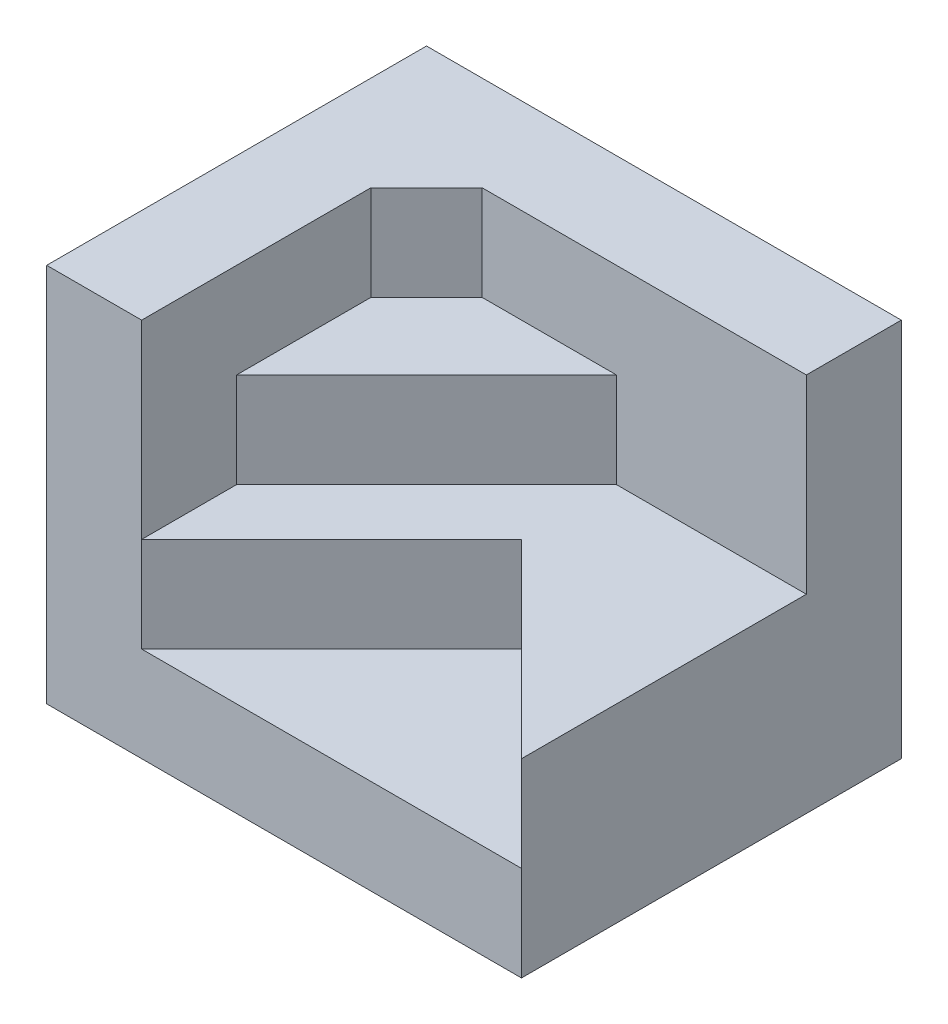
ISO-10303-21;
HEADER;
FILE_DESCRIPTION(('STEP AP214'),'2;1');
FILE_NAME('part.step','',(''),(''),'','','');
FILE_SCHEMA(('AUTOMOTIVE_DESIGN { 1 0 10303 214 1 1 1 1 }'));
ENDSEC;
DATA;
#1=APPLICATION_CONTEXT('core data for automotive mechanical design processes');
#2=APPLICATION_PROTOCOL_DEFINITION('international standard','automotive_design',2000,#1);
#3=PRODUCT_CONTEXT('',#1,'mechanical');
#4=PRODUCT('Part','Part','',(#3));
#5=PRODUCT_RELATED_PRODUCT_CATEGORY('part','',(#4));
#6=PRODUCT_DEFINITION_FORMATION('','',#4);
#7=PRODUCT_DEFINITION_CONTEXT('part definition',#1,'design');
#8=PRODUCT_DEFINITION('design','',#6,#7);
#9=PRODUCT_DEFINITION_SHAPE('','',#8);
#10=(LENGTH_UNIT() NAMED_UNIT(*) SI_UNIT(.MILLI.,.METRE.));
#11=(NAMED_UNIT(*) PLANE_ANGLE_UNIT() SI_UNIT($,.RADIAN.));
#12=(NAMED_UNIT(*) SI_UNIT($,.STERADIAN.) SOLID_ANGLE_UNIT());
#13=UNCERTAINTY_MEASURE_WITH_UNIT(LENGTH_MEASURE(1.E-05),#10,'distance_accuracy_value','');
#14=(GEOMETRIC_REPRESENTATION_CONTEXT(3) GLOBAL_UNCERTAINTY_ASSIGNED_CONTEXT((#13)) GLOBAL_UNIT_ASSIGNED_CONTEXT((#10,
#11,#12)) REPRESENTATION_CONTEXT('',''));
#15=CARTESIAN_POINT('',(0.,0.,0.));
#16=DIRECTION('',(0.,0.,1.));
#17=DIRECTION('',(1.,0.,0.));
#18=AXIS2_PLACEMENT_3D('',#15,#16,#17);
#19=CARTESIAN_POINT('',(-40.,40.,-20.));
#20=DIRECTION('',(0.,0.,-1.));
#21=DIRECTION('',(-1.,0.,0.));
#22=AXIS2_PLACEMENT_3D('',#19,#20,#21);
#23=PLANE('',#22);
#24=DIRECTION('',(1.,0.,0.));
#25=VECTOR('',#24,1.);
#26=CARTESIAN_POINT('',(-40.,0.,-20.));
#27=LINE('',#26,#25);
#28=CARTESIAN_POINT('',(-40.,0.,-20.));
#29=VERTEX_POINT('',#28);
#30=CARTESIAN_POINT('',(10.,0.,-20.));
#31=VERTEX_POINT('',#30);
#32=EDGE_CURVE('E167',#29,#31,#27,.T.);
#33=ORIENTED_EDGE('',*,*,#32,.F.);
#34=DIRECTION('',(0.,-1.,0.));
#35=VECTOR('',#34,1.);
#36=CARTESIAN_POINT('',(-40.,40.,-20.));
#37=LINE('',#36,#35);
#38=CARTESIAN_POINT('',(-40.,40.,-20.));
#39=VERTEX_POINT('',#38);
#40=EDGE_CURVE('E11',#39,#29,#37,.T.);
#41=ORIENTED_EDGE('',*,*,#40,.F.);
#42=DIRECTION('',(1.,0.,0.));
#43=VECTOR('',#42,1.);
#44=CARTESIAN_POINT('',(-40.,40.,-20.));
#45=LINE('',#44,#43);
#46=CARTESIAN_POINT('',(10.,40.,-20.));
#47=VERTEX_POINT('',#46);
#48=EDGE_CURVE('E163',#39,#47,#45,.T.);
#49=ORIENTED_EDGE('',*,*,#48,.T.);
#50=DIRECTION('',(0.,-1.,0.));
#51=VECTOR('',#50,1.);
#52=CARTESIAN_POINT('',(10.,40.,-20.));
#53=LINE('',#52,#51);
#54=EDGE_CURVE('E39',#47,#31,#53,.T.);
#55=ORIENTED_EDGE('',*,*,#54,.T.);
#56=EDGE_LOOP('',(#33,#41,#49,#55));
#57=FACE_BOUND('',#56,.T.);
#58=ADVANCED_FACE('F36',(#57),#23,.T.);
#59=CARTESIAN_POINT('',(-40.,40.,-20.));
#60=DIRECTION('',(1.,0.,0.));
#61=DIRECTION('',(0.,0.,-1.));
#62=AXIS2_PLACEMENT_3D('',#59,#60,#61);
#63=PLANE('',#62);
#64=DIRECTION('',(0.,0.,1.));
#65=VECTOR('',#64,1.);
#66=CARTESIAN_POINT('',(-40.,0.,-20.));
#67=LINE('',#66,#65);
#68=CARTESIAN_POINT('',(-40.,0.,20.));
#69=VERTEX_POINT('',#68);
#70=EDGE_CURVE('E70',#29,#69,#67,.T.);
#71=ORIENTED_EDGE('',*,*,#70,.T.);
#72=DIRECTION('',(0.,-1.,0.));
#73=VECTOR('',#72,1.);
#74=CARTESIAN_POINT('',(-40.,40.,20.));
#75=LINE('',#74,#73);
#76=CARTESIAN_POINT('',(-40.,40.,20.));
#77=VERTEX_POINT('',#76);
#78=EDGE_CURVE('E45',#77,#69,#75,.T.);
#79=ORIENTED_EDGE('',*,*,#78,.F.);
#80=DIRECTION('',(0.,0.,1.));
#81=VECTOR('',#80,1.);
#82=CARTESIAN_POINT('',(-40.,40.,-20.));
#83=LINE('',#82,#81);
#84=EDGE_CURVE('E171',#39,#77,#83,.T.);
#85=ORIENTED_EDGE('',*,*,#84,.F.);
#86=ORIENTED_EDGE('',*,*,#40,.T.);
#87=EDGE_LOOP('',(#71,#79,#85,#86));
#88=FACE_BOUND('',#87,.T.);
#89=ADVANCED_FACE('F268',(#88),#63,.F.);
#90=CARTESIAN_POINT('',(-40.,40.,20.));
#91=DIRECTION('',(0.,0.,-1.));
#92=DIRECTION('',(-1.,0.,0.));
#93=AXIS2_PLACEMENT_3D('',#90,#91,#92);
#94=PLANE('',#93);
#95=DIRECTION('',(1.,0.,0.));
#96=VECTOR('',#95,1.);
#97=CARTESIAN_POINT('',(10.,10.,20.));
#98=LINE('',#97,#96);
#99=CARTESIAN_POINT('',(-30.,10.,20.));
#100=VERTEX_POINT('',#99);
#101=CARTESIAN_POINT('',(10.,10.,20.));
#102=VERTEX_POINT('',#101);
#103=EDGE_CURVE('E141',#100,#102,#98,.T.);
#104=ORIENTED_EDGE('',*,*,#103,.F.);
#105=DIRECTION('',(0.,1.,0.));
#106=VECTOR('',#105,1.);
#107=CARTESIAN_POINT('',(-30.,10.,20.));
#108=LINE('',#107,#106);
#109=CARTESIAN_POINT('',(-30.,20.,20.));
#110=VERTEX_POINT('',#109);
#111=EDGE_CURVE('E223',#100,#110,#108,.T.);
#112=ORIENTED_EDGE('',*,*,#111,.T.);
#113=DIRECTION('',(0.,1.,0.));
#114=VECTOR('',#113,1.);
#115=CARTESIAN_POINT('',(-30.,20.,20.));
#116=LINE('',#115,#114);
#117=CARTESIAN_POINT('',(-30.,40.,20.));
#118=VERTEX_POINT('',#117);
#119=EDGE_CURVE('E206',#110,#118,#116,.T.);
#120=ORIENTED_EDGE('',*,*,#119,.T.);
#121=DIRECTION('',(1.,0.,0.));
#122=VECTOR('',#121,1.);
#123=CARTESIAN_POINT('',(-40.,40.,20.));
#124=LINE('',#123,#122);
#125=EDGE_CURVE('E173',#77,#118,#124,.T.);
#126=ORIENTED_EDGE('',*,*,#125,.F.);
#127=ORIENTED_EDGE('',*,*,#78,.T.);
#128=DIRECTION('',(1.,0.,0.));
#129=VECTOR('',#128,1.);
#130=CARTESIAN_POINT('',(-40.,0.,20.));
#131=LINE('',#130,#129);
#132=CARTESIAN_POINT('',(10.,0.,20.));
#133=VERTEX_POINT('',#132);
#134=EDGE_CURVE('E154',#69,#133,#131,.T.);
#135=ORIENTED_EDGE('',*,*,#134,.T.);
#136=DIRECTION('',(0.,-1.,0.));
#137=VECTOR('',#136,1.);
#138=CARTESIAN_POINT('',(10.,40.,20.));
#139=LINE('',#138,#137);
#140=EDGE_CURVE('E151',#102,#133,#139,.T.);
#141=ORIENTED_EDGE('',*,*,#140,.F.);
#142=EDGE_LOOP('',(#104,#112,#120,#126,#127,#135,#141));
#143=FACE_BOUND('',#142,.T.);
#144=ADVANCED_FACE('F152',(#143),#94,.F.);
#145=CARTESIAN_POINT('',(10.,40.,-20.));
#146=DIRECTION('',(1.,0.,0.));
#147=DIRECTION('',(0.,0.,-1.));
#148=AXIS2_PLACEMENT_3D('',#145,#146,#147);
#149=PLANE('',#148);
#150=DIRECTION('',(0.,1.,0.));
#151=VECTOR('',#150,1.);
#152=CARTESIAN_POINT('',(10.,20.,-10.));
#153=LINE('',#152,#151);
#154=CARTESIAN_POINT('',(10.,20.,-10.));
#155=VERTEX_POINT('',#154);
#156=CARTESIAN_POINT('',(10.,40.,-10.));
#157=VERTEX_POINT('',#156);
#158=EDGE_CURVE('E210',#155,#157,#153,.T.);
#159=ORIENTED_EDGE('',*,*,#158,.F.);
#160=DIRECTION('',(0.,0.,-1.));
#161=VECTOR('',#160,1.);
#162=CARTESIAN_POINT('',(10.,20.,-10.));
#163=LINE('',#162,#161);
#164=CARTESIAN_POINT('',(10.,20.,20.));
#165=VERTEX_POINT('',#164);
#166=EDGE_CURVE('E159',#165,#155,#163,.T.);
#167=ORIENTED_EDGE('',*,*,#166,.F.);
#168=EDGE_CURVE('E134',#165,#102,#139,.T.);
#169=ORIENTED_EDGE('',*,*,#168,.T.);
#170=ORIENTED_EDGE('',*,*,#140,.T.);
#171=DIRECTION('',(0.,0.,1.));
#172=VECTOR('',#171,1.);
#173=CARTESIAN_POINT('',(10.,0.,-20.));
#174=LINE('',#173,#172);
#175=EDGE_CURVE('E165',#31,#133,#174,.T.);
#176=ORIENTED_EDGE('',*,*,#175,.F.);
#177=ORIENTED_EDGE('',*,*,#54,.F.);
#178=DIRECTION('',(0.,0.,1.));
#179=VECTOR('',#178,1.);
#180=CARTESIAN_POINT('',(10.,40.,-20.));
#181=LINE('',#180,#179);
#182=EDGE_CURVE('E176',#47,#157,#181,.T.);
#183=ORIENTED_EDGE('',*,*,#182,.T.);
#184=EDGE_LOOP('',(#159,#167,#169,#170,#176,#177,#183));
#185=FACE_BOUND('',#184,.T.);
#186=ADVANCED_FACE('F158',(#185),#149,.T.);
#187=CARTESIAN_POINT('',(0.,40.,0.));
#188=DIRECTION('',(0.,-1.,0.));
#189=DIRECTION('',(0.,0.,-1.));
#190=AXIS2_PLACEMENT_3D('',#187,#188,#189);
#191=PLANE('',#190);
#192=DIRECTION('',(-1.,0.,0.));
#193=VECTOR('',#192,1.);
#194=CARTESIAN_POINT('',(-24.1421356237309,40.,-10.));
#195=LINE('',#194,#193);
#196=CARTESIAN_POINT('',(-24.1421356237309,40.,-10.));
#197=VERTEX_POINT('',#196);
#198=EDGE_CURVE('E189',#157,#197,#195,.T.);
#199=ORIENTED_EDGE('',*,*,#198,.F.);
#200=ORIENTED_EDGE('',*,*,#182,.F.);
#201=ORIENTED_EDGE('',*,*,#48,.F.);
#202=ORIENTED_EDGE('',*,*,#84,.T.);
#203=ORIENTED_EDGE('',*,*,#125,.T.);
#204=DIRECTION('',(0.,0.,1.));
#205=VECTOR('',#204,1.);
#206=CARTESIAN_POINT('',(-30.,40.,10.));
#207=LINE('',#206,#205);
#208=CARTESIAN_POINT('',(-30.,40.,-4.14213562373095));
#209=VERTEX_POINT('',#208);
#210=EDGE_CURVE('E183',#209,#118,#207,.T.);
#211=ORIENTED_EDGE('',*,*,#210,.F.);
#212=DIRECTION('',(-0.707106781186548,0.,0.707106781186547));
#213=VECTOR('',#212,1.);
#214=CARTESIAN_POINT('',(-24.1421356237309,40.,-10.));
#215=LINE('',#214,#213);
#216=EDGE_CURVE('E186',#197,#209,#215,.T.);
#217=ORIENTED_EDGE('',*,*,#216,.F.);
#218=EDGE_LOOP('',(#199,#200,#201,#202,#203,#211,#217));
#219=FACE_BOUND('',#218,.T.);
#220=ADVANCED_FACE('F243',(#219),#191,.F.);
#221=CARTESIAN_POINT('',(0.,0.,0.));
#222=DIRECTION('',(0.,-1.,0.));
#223=DIRECTION('',(0.,0.,-1.));
#224=AXIS2_PLACEMENT_3D('',#221,#222,#223);
#225=PLANE('',#224);
#226=ORIENTED_EDGE('',*,*,#32,.T.);
#227=ORIENTED_EDGE('',*,*,#175,.T.);
#228=ORIENTED_EDGE('',*,*,#134,.F.);
#229=ORIENTED_EDGE('',*,*,#70,.F.);
#230=EDGE_LOOP('',(#226,#227,#228,#229));
#231=FACE_BOUND('',#230,.T.);
#232=ADVANCED_FACE('F246',(#231),#225,.T.);
#233=CARTESIAN_POINT('',(-30.,30.,10.));
#234=DIRECTION('',(-1.,0.,0.));
#235=DIRECTION('',(0.,0.,1.));
#236=AXIS2_PLACEMENT_3D('',#233,#234,#235);
#237=PLANE('',#236);
#238=ORIENTED_EDGE('',*,*,#210,.T.);
#239=ORIENTED_EDGE('',*,*,#119,.F.);
#240=DIRECTION('',(0.,0.,1.));
#241=VECTOR('',#240,1.);
#242=CARTESIAN_POINT('',(-30.,20.,10.));
#243=LINE('',#242,#241);
#244=CARTESIAN_POINT('',(-30.,20.,10.));
#245=VERTEX_POINT('',#244);
#246=EDGE_CURVE('E217',#245,#110,#243,.T.);
#247=ORIENTED_EDGE('',*,*,#246,.F.);
#248=DIRECTION('',(0.,1.,0.));
#249=VECTOR('',#248,1.);
#250=CARTESIAN_POINT('',(-30.,20.,10.));
#251=LINE('',#250,#249);
#252=CARTESIAN_POINT('',(-30.,30.,10.));
#253=VERTEX_POINT('',#252);
#254=EDGE_CURVE('E203',#245,#253,#251,.T.);
#255=ORIENTED_EDGE('',*,*,#254,.T.);
#256=DIRECTION('',(0.,0.,1.));
#257=VECTOR('',#256,1.);
#258=CARTESIAN_POINT('',(-30.,30.,10.));
#259=LINE('',#258,#257);
#260=CARTESIAN_POINT('',(-30.,30.,-4.14213562373095));
#261=VERTEX_POINT('',#260);
#262=EDGE_CURVE('E181',#261,#253,#259,.T.);
#263=ORIENTED_EDGE('',*,*,#262,.F.);
#264=DIRECTION('',(0.,1.,0.));
#265=VECTOR('',#264,1.);
#266=CARTESIAN_POINT('',(-30.,30.,-4.14213562373095));
#267=LINE('',#266,#265);
#268=EDGE_CURVE('E170',#261,#209,#267,.T.);
#269=ORIENTED_EDGE('',*,*,#268,.T.);
#270=EDGE_LOOP('',(#238,#239,#247,#255,#263,#269));
#271=FACE_BOUND('',#270,.T.);
#272=ADVANCED_FACE('F238',(#271),#237,.F.);
#273=CARTESIAN_POINT('',(-24.1421356237309,30.,-10.));
#274=DIRECTION('',(-0.707106781186547,0.,-0.707106781186548));
#275=DIRECTION('',(-0.707106781186548,0.,0.707106781186547));
#276=AXIS2_PLACEMENT_3D('',#273,#274,#275);
#277=PLANE('',#276);
#278=ORIENTED_EDGE('',*,*,#216,.T.);
#279=ORIENTED_EDGE('',*,*,#268,.F.);
#280=DIRECTION('',(-0.707106781186548,0.,0.707106781186547));
#281=VECTOR('',#280,1.);
#282=CARTESIAN_POINT('',(-24.1421356237309,30.,-10.));
#283=LINE('',#282,#281);
#284=CARTESIAN_POINT('',(-24.1421356237309,30.,-10.));
#285=VERTEX_POINT('',#284);
#286=EDGE_CURVE('E195',#285,#261,#283,.T.);
#287=ORIENTED_EDGE('',*,*,#286,.F.);
#288=DIRECTION('',(0.,1.,0.));
#289=VECTOR('',#288,1.);
#290=CARTESIAN_POINT('',(-24.1421356237309,30.,-10.));
#291=LINE('',#290,#289);
#292=EDGE_CURVE('E179',#285,#197,#291,.T.);
#293=ORIENTED_EDGE('',*,*,#292,.T.);
#294=EDGE_LOOP('',(#278,#279,#287,#293));
#295=FACE_BOUND('',#294,.T.);
#296=ADVANCED_FACE('F258',(#295),#277,.F.);
#297=CARTESIAN_POINT('',(-24.1421356237309,30.,-10.));
#298=DIRECTION('',(0.,0.,-1.));
#299=DIRECTION('',(-1.,0.,0.));
#300=AXIS2_PLACEMENT_3D('',#297,#298,#299);
#301=PLANE('',#300);
#302=ORIENTED_EDGE('',*,*,#198,.T.);
#303=ORIENTED_EDGE('',*,*,#292,.F.);
#304=DIRECTION('',(-1.,0.,0.));
#305=VECTOR('',#304,1.);
#306=CARTESIAN_POINT('',(-24.1421356237309,30.,-10.));
#307=LINE('',#306,#305);
#308=CARTESIAN_POINT('',(-10.,30.,-10.));
#309=VERTEX_POINT('',#308);
#310=EDGE_CURVE('E198',#309,#285,#307,.T.);
#311=ORIENTED_EDGE('',*,*,#310,.F.);
#312=DIRECTION('',(0.,1.,0.));
#313=VECTOR('',#312,1.);
#314=CARTESIAN_POINT('',(-10.,20.,-10.));
#315=LINE('',#314,#313);
#316=CARTESIAN_POINT('',(-10.,20.,-10.));
#317=VERTEX_POINT('',#316);
#318=EDGE_CURVE('E192',#317,#309,#315,.T.);
#319=ORIENTED_EDGE('',*,*,#318,.F.);
#320=DIRECTION('',(-1.,0.,0.));
#321=VECTOR('',#320,1.);
#322=CARTESIAN_POINT('',(-10.,20.,-10.));
#323=LINE('',#322,#321);
#324=EDGE_CURVE('E207',#155,#317,#323,.T.);
#325=ORIENTED_EDGE('',*,*,#324,.F.);
#326=ORIENTED_EDGE('',*,*,#158,.T.);
#327=EDGE_LOOP('',(#302,#303,#311,#319,#325,#326));
#328=FACE_BOUND('',#327,.T.);
#329=ADVANCED_FACE('F249',(#328),#301,.F.);
#330=CARTESIAN_POINT('',(0.,30.,0.));
#331=DIRECTION('',(0.,-1.,0.));
#332=DIRECTION('',(0.,0.,-1.));
#333=AXIS2_PLACEMENT_3D('',#330,#331,#332);
#334=PLANE('',#333);
#335=DIRECTION('',(0.707106781186548,0.,-0.707106781186548));
#336=VECTOR('',#335,1.);
#337=CARTESIAN_POINT('',(-10.,30.,-10.));
#338=LINE('',#337,#336);
#339=EDGE_CURVE('E185',#253,#309,#338,.T.);
#340=ORIENTED_EDGE('',*,*,#339,.T.);
#341=ORIENTED_EDGE('',*,*,#310,.T.);
#342=ORIENTED_EDGE('',*,*,#286,.T.);
#343=ORIENTED_EDGE('',*,*,#262,.T.);
#344=EDGE_LOOP('',(#340,#341,#342,#343));
#345=FACE_BOUND('',#344,.T.);
#346=ADVANCED_FACE('F255',(#345),#334,.F.);
#347=CARTESIAN_POINT('',(-10.,20.,-10.));
#348=DIRECTION('',(-0.707106781186548,0.,-0.707106781186548));
#349=DIRECTION('',(-0.707106781186548,0.,0.707106781186548));
#350=AXIS2_PLACEMENT_3D('',#347,#348,#349);
#351=PLANE('',#350);
#352=ORIENTED_EDGE('',*,*,#254,.F.);
#353=DIRECTION('',(-0.707106781186548,0.,0.707106781186548));
#354=VECTOR('',#353,1.);
#355=CARTESIAN_POINT('',(-10.,20.,-10.));
#356=LINE('',#355,#354);
#357=EDGE_CURVE('E220',#317,#245,#356,.T.);
#358=ORIENTED_EDGE('',*,*,#357,.F.);
#359=ORIENTED_EDGE('',*,*,#318,.T.);
#360=ORIENTED_EDGE('',*,*,#339,.F.);
#361=EDGE_LOOP('',(#352,#358,#359,#360));
#362=FACE_BOUND('',#361,.T.);
#363=ADVANCED_FACE('F253',(#362),#351,.F.);
#364=CARTESIAN_POINT('',(0.,20.,0.));
#365=DIRECTION('',(0.,1.,0.));
#366=DIRECTION('',(0.,0.,1.));
#367=AXIS2_PLACEMENT_3D('',#364,#365,#366);
#368=PLANE('',#367);
#369=DIRECTION('',(-0.707106781186551,0.,0.707106781186544));
#370=VECTOR('',#369,1.);
#371=CARTESIAN_POINT('',(-30.,20.,20.));
#372=LINE('',#371,#370);
#373=CARTESIAN_POINT('',(-9.99999999999979,20.,0.));
#374=VERTEX_POINT('',#373);
#375=EDGE_CURVE('E148',#374,#110,#372,.T.);
#376=ORIENTED_EDGE('',*,*,#375,.F.);
#377=DIRECTION('',(-0.707106781186544,0.,-0.707106781186551));
#378=VECTOR('',#377,1.);
#379=CARTESIAN_POINT('',(-9.99999999999979,20.,0.));
#380=LINE('',#379,#378);
#381=EDGE_CURVE('E227',#165,#374,#380,.T.);
#382=ORIENTED_EDGE('',*,*,#381,.F.);
#383=ORIENTED_EDGE('',*,*,#166,.T.);
#384=ORIENTED_EDGE('',*,*,#324,.T.);
#385=ORIENTED_EDGE('',*,*,#357,.T.);
#386=ORIENTED_EDGE('',*,*,#246,.T.);
#387=EDGE_LOOP('',(#376,#382,#383,#384,#385,#386));
#388=FACE_BOUND('',#387,.T.);
#389=ADVANCED_FACE('F231',(#388),#368,.T.);
#390=CARTESIAN_POINT('',(-30.,10.,20.));
#391=DIRECTION('',(-0.707106781186544,0.,-0.707106781186551));
#392=DIRECTION('',(-0.707106781186551,0.,0.707106781186544));
#393=AXIS2_PLACEMENT_3D('',#390,#391,#392);
#394=PLANE('',#393);
#395=ORIENTED_EDGE('',*,*,#375,.T.);
#396=ORIENTED_EDGE('',*,*,#111,.F.);
#397=DIRECTION('',(-0.707106781186551,0.,0.707106781186544));
#398=VECTOR('',#397,1.);
#399=CARTESIAN_POINT('',(-30.,10.,20.));
#400=LINE('',#399,#398);
#401=CARTESIAN_POINT('',(-9.99999999999979,10.,0.));
#402=VERTEX_POINT('',#401);
#403=EDGE_CURVE('E140',#402,#100,#400,.T.);
#404=ORIENTED_EDGE('',*,*,#403,.F.);
#405=DIRECTION('',(0.,1.,0.));
#406=VECTOR('',#405,1.);
#407=CARTESIAN_POINT('',(-9.99999999999979,10.,0.));
#408=LINE('',#407,#406);
#409=EDGE_CURVE('E136',#402,#374,#408,.T.);
#410=ORIENTED_EDGE('',*,*,#409,.T.);
#411=EDGE_LOOP('',(#395,#396,#404,#410));
#412=FACE_BOUND('',#411,.T.);
#413=ADVANCED_FACE('F234',(#412),#394,.F.);
#414=CARTESIAN_POINT('',(-9.99999999999979,10.,0.));
#415=DIRECTION('',(0.707106781186551,0.,-0.707106781186544));
#416=DIRECTION('',(-0.707106781186544,0.,-0.707106781186551));
#417=AXIS2_PLACEMENT_3D('',#414,#415,#416);
#418=PLANE('',#417);
#419=ORIENTED_EDGE('',*,*,#381,.T.);
#420=ORIENTED_EDGE('',*,*,#409,.F.);
#421=DIRECTION('',(-0.707106781186544,0.,-0.707106781186551));
#422=VECTOR('',#421,1.);
#423=CARTESIAN_POINT('',(-9.99999999999979,10.,0.));
#424=LINE('',#423,#422);
#425=EDGE_CURVE('E129',#102,#402,#424,.T.);
#426=ORIENTED_EDGE('',*,*,#425,.F.);
#427=ORIENTED_EDGE('',*,*,#168,.F.);
#428=EDGE_LOOP('',(#419,#420,#426,#427));
#429=FACE_BOUND('',#428,.T.);
#430=ADVANCED_FACE('F132',(#429),#418,.F.);
#431=CARTESIAN_POINT('',(0.,10.,0.));
#432=DIRECTION('',(0.,-1.,0.));
#433=DIRECTION('',(0.,0.,-1.));
#434=AXIS2_PLACEMENT_3D('',#431,#432,#433);
#435=PLANE('',#434);
#436=ORIENTED_EDGE('',*,*,#103,.T.);
#437=ORIENTED_EDGE('',*,*,#425,.T.);
#438=ORIENTED_EDGE('',*,*,#403,.T.);
#439=EDGE_LOOP('',(#436,#437,#438));
#440=FACE_BOUND('',#439,.T.);
#441=ADVANCED_FACE('F145',(#440),#435,.F.);
#442=CLOSED_SHELL('',(#58,#89,#144,#186,#220,#232,#272,#296,#329,#346,#363,#389,#413,#430,#441));
#443=MANIFOLD_SOLID_BREP('B2',#442);
#444=ADVANCED_BREP_SHAPE_REPRESENTATION('',(#18,#443),#14);
#445=SHAPE_DEFINITION_REPRESENTATION(#9,#444);
ENDSEC;
END-ISO-10303-21;
